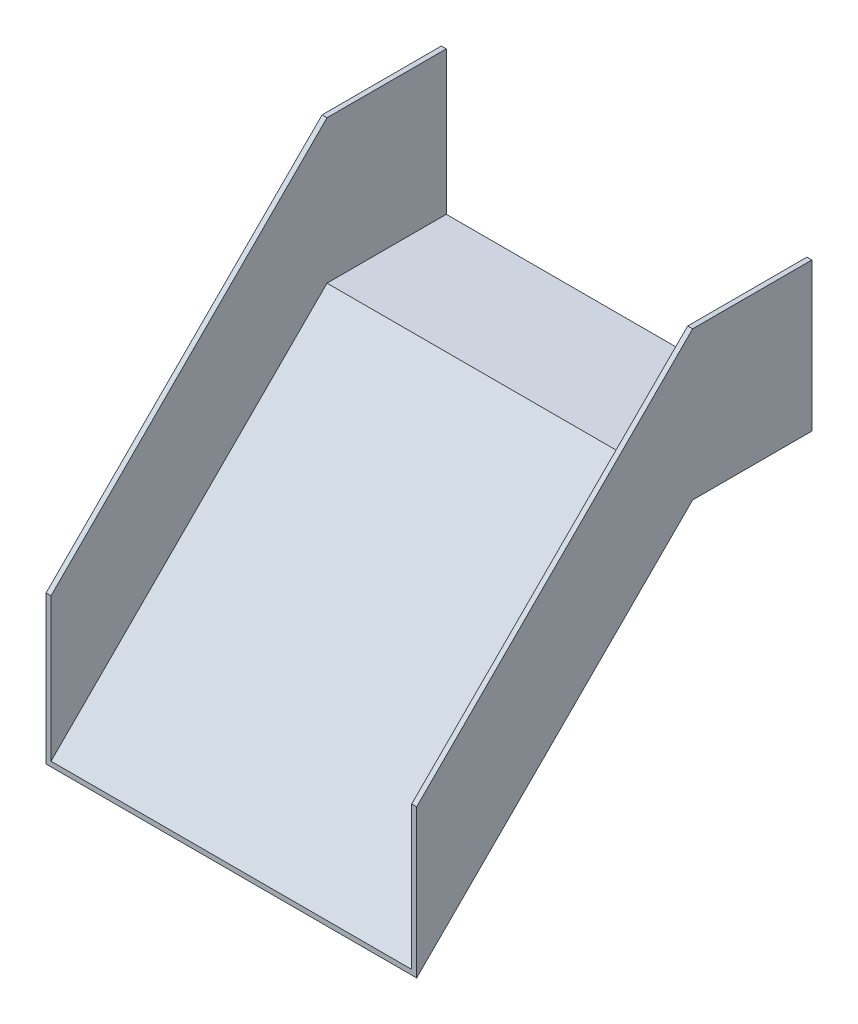
ISO-10303-21;
HEADER;
FILE_DESCRIPTION(('STEP AP214'),'2;1');
FILE_NAME('part.step','',(''),(''),'','','');
FILE_SCHEMA(('AUTOMOTIVE_DESIGN { 1 0 10303 214 1 1 1 1 }'));
ENDSEC;
DATA;
#1=APPLICATION_CONTEXT('core data for automotive mechanical design processes');
#2=APPLICATION_PROTOCOL_DEFINITION('international standard','automotive_design',2000,#1);
#3=PRODUCT_CONTEXT('',#1,'mechanical');
#4=PRODUCT('Part','Part','',(#3));
#5=PRODUCT_RELATED_PRODUCT_CATEGORY('part','',(#4));
#6=PRODUCT_DEFINITION_FORMATION('','',#4);
#7=PRODUCT_DEFINITION_CONTEXT('part definition',#1,'design');
#8=PRODUCT_DEFINITION('design','',#6,#7);
#9=PRODUCT_DEFINITION_SHAPE('','',#8);
#10=(LENGTH_UNIT() NAMED_UNIT(*) SI_UNIT(.MILLI.,.METRE.));
#11=(NAMED_UNIT(*) PLANE_ANGLE_UNIT() SI_UNIT($,.RADIAN.));
#12=(NAMED_UNIT(*) SI_UNIT($,.STERADIAN.) SOLID_ANGLE_UNIT());
#13=UNCERTAINTY_MEASURE_WITH_UNIT(LENGTH_MEASURE(1.E-05),#10,'distance_accuracy_value','');
#14=(GEOMETRIC_REPRESENTATION_CONTEXT(3) GLOBAL_UNCERTAINTY_ASSIGNED_CONTEXT((#13)) GLOBAL_UNIT_ASSIGNED_CONTEXT((#10,
#11,#12)) REPRESENTATION_CONTEXT('',''));
#15=CARTESIAN_POINT('',(0.,0.,0.));
#16=DIRECTION('',(0.,0.,1.));
#17=DIRECTION('',(1.,0.,0.));
#18=AXIS2_PLACEMENT_3D('',#15,#16,#17);
#19=CARTESIAN_POINT('',(150.,60.,48.28));
#20=DIRECTION('',(0.,0.707106781186547,0.707106781186548));
#21=DIRECTION('',(-1.,0.,0.));
#22=AXIS2_PLACEMENT_3D('',#19,#20,#21);
#23=PLANE('',#22);
#24=DIRECTION('',(-1.,0.,0.));
#25=VECTOR('',#24,1.);
#26=CARTESIAN_POINT('',(75.,-51.72,160.));
#27=LINE('',#26,#25);
#28=CARTESIAN_POINT('',(150.,-51.72,160.));
#29=VERTEX_POINT('',#28);
#30=CARTESIAN_POINT('',(148.,-51.72,160.));
#31=VERTEX_POINT('',#30);
#32=EDGE_CURVE('E144',#29,#31,#27,.T.);
#33=ORIENTED_EDGE('',*,*,#32,.F.);
#34=DIRECTION('',(0.,-0.707106781186548,0.707106781186547));
#35=VECTOR('',#34,1.);
#36=CARTESIAN_POINT('',(150.,60.,48.28));
#37=LINE('',#36,#35);
#38=CARTESIAN_POINT('',(150.,60.,48.28));
#39=VERTEX_POINT('',#38);
#40=EDGE_CURVE('E127',#29,#39,#37,.F.);
#41=ORIENTED_EDGE('',*,*,#40,.T.);
#42=DIRECTION('',(-1.,0.,0.));
#43=VECTOR('',#42,1.);
#44=CARTESIAN_POINT('',(149.,60.,48.28));
#45=LINE('',#44,#43);
#46=CARTESIAN_POINT('',(148.,60.,48.28));
#47=VERTEX_POINT('',#46);
#48=EDGE_CURVE('E163',#39,#47,#45,.T.);
#49=ORIENTED_EDGE('',*,*,#48,.T.);
#50=DIRECTION('',(0.,-0.707106781186548,0.707106781186547));
#51=VECTOR('',#50,1.);
#52=CARTESIAN_POINT('',(148.,60.,48.28));
#53=LINE('',#52,#51);
#54=EDGE_CURVE('E150',#47,#31,#53,.T.);
#55=ORIENTED_EDGE('',*,*,#54,.T.);
#56=EDGE_LOOP('',(#33,#41,#49,#55));
#57=FACE_BOUND('',#56,.T.);
#58=ADVANCED_FACE('F17',(#57),#23,.T.);
#59=CARTESIAN_POINT('',(148.,2.,48.28));
#60=DIRECTION('',(0.,0.707106781186547,0.707106781186547));
#61=DIRECTION('',(-1.,0.,0.));
#62=AXIS2_PLACEMENT_3D('',#59,#60,#61);
#63=PLANE('',#62);
#64=DIRECTION('',(-1.,0.,0.));
#65=VECTOR('',#64,1.);
#66=CARTESIAN_POINT('',(75.,-109.72000002,160.));
#67=LINE('',#66,#65);
#68=CARTESIAN_POINT('',(148.000000003125,-109.72000001,160.));
#69=VERTEX_POINT('',#68);
#70=CARTESIAN_POINT('',(2.,-109.72000001,160.));
#71=VERTEX_POINT('',#70);
#72=EDGE_CURVE('E120',#69,#71,#67,.T.);
#73=ORIENTED_EDGE('',*,*,#72,.F.);
#74=DIRECTION('',(0.,-0.707106781186547,0.707106781186547));
#75=VECTOR('',#74,1.);
#76=CARTESIAN_POINT('',(148.0000000125,2.,48.28));
#77=LINE('',#76,#75);
#78=CARTESIAN_POINT('',(148.00000000625,2.,48.28));
#79=VERTEX_POINT('',#78);
#80=EDGE_CURVE('E149',#69,#79,#77,.F.);
#81=ORIENTED_EDGE('',*,*,#80,.T.);
#82=DIRECTION('',(-1.,0.,0.));
#83=VECTOR('',#82,1.);
#84=CARTESIAN_POINT('',(75.,2.,48.28));
#85=LINE('',#84,#83);
#86=CARTESIAN_POINT('',(2.,2.0000000319,48.2799999681));
#87=VERTEX_POINT('',#86);
#88=EDGE_CURVE('E151',#79,#87,#85,.T.);
#89=ORIENTED_EDGE('',*,*,#88,.T.);
#90=DIRECTION('',(0.,-0.707106781186547,0.707106781186547));
#91=VECTOR('',#90,1.);
#92=CARTESIAN_POINT('',(2.,2.,48.28));
#93=LINE('',#92,#91);
#94=EDGE_CURVE('E167',#87,#71,#93,.T.);
#95=ORIENTED_EDGE('',*,*,#94,.T.);
#96=EDGE_LOOP('',(#73,#81,#89,#95));
#97=FACE_BOUND('',#96,.T.);
#98=ADVANCED_FACE('F253',(#97),#63,.T.);
#99=CARTESIAN_POINT('',(0.,-111.72,160.));
#100=DIRECTION('',(0.,0.,1.));
#101=DIRECTION('',(1.,0.,0.));
#102=AXIS2_PLACEMENT_3D('',#99,#100,#101);
#103=PLANE('',#102);
#104=DIRECTION('',(0.,1.,0.));
#105=VECTOR('',#104,1.);
#106=CARTESIAN_POINT('',(2.,-24.86,160.));
#107=LINE('',#106,#105);
#108=CARTESIAN_POINT('',(1.999999975,-51.72000001595,160.));
#109=VERTEX_POINT('',#108);
#110=EDGE_CURVE('E168',#71,#109,#107,.T.);
#111=ORIENTED_EDGE('',*,*,#110,.T.);
#112=DIRECTION('',(1.,0.,0.));
#113=VECTOR('',#112,1.);
#114=CARTESIAN_POINT('',(1.,-51.72,160.));
#115=LINE('',#114,#113);
#116=CARTESIAN_POINT('',(0.,-51.72,160.));
#117=VERTEX_POINT('',#116);
#118=EDGE_CURVE('E171',#117,#109,#115,.T.);
#119=ORIENTED_EDGE('',*,*,#118,.F.);
#120=DIRECTION('',(0.,-1.,0.));
#121=VECTOR('',#120,1.);
#122=CARTESIAN_POINT('',(0.,-25.86,160.));
#123=LINE('',#122,#121);
#124=CARTESIAN_POINT('',(0.,-111.72,160.));
#125=VERTEX_POINT('',#124);
#126=EDGE_CURVE('E117',#117,#125,#123,.T.);
#127=ORIENTED_EDGE('',*,*,#126,.T.);
#128=DIRECTION('',(-1.,0.,0.));
#129=VECTOR('',#128,1.);
#130=CARTESIAN_POINT('',(75.,-111.72,160.));
#131=LINE('',#130,#129);
#132=CARTESIAN_POINT('',(150.,-111.72,160.));
#133=VERTEX_POINT('',#132);
#134=EDGE_CURVE('E111',#133,#125,#131,.T.);
#135=ORIENTED_EDGE('',*,*,#134,.F.);
#136=DIRECTION('',(0.,1.,0.));
#137=VECTOR('',#136,1.);
#138=CARTESIAN_POINT('',(150.,-25.86,160.));
#139=LINE('',#138,#137);
#140=EDGE_CURVE('E115',#133,#29,#139,.T.);
#141=ORIENTED_EDGE('',*,*,#140,.T.);
#142=ORIENTED_EDGE('',*,*,#32,.T.);
#143=DIRECTION('',(0.,-1.,0.));
#144=VECTOR('',#143,1.);
#145=CARTESIAN_POINT('',(148.,-24.86,160.));
#146=LINE('',#145,#144);
#147=EDGE_CURVE('E145',#31,#69,#146,.T.);
#148=ORIENTED_EDGE('',*,*,#147,.T.);
#149=ORIENTED_EDGE('',*,*,#72,.T.);
#150=EDGE_LOOP('',(#111,#119,#127,#135,#141,#142,#148,#149));
#151=FACE_BOUND('',#150,.T.);
#152=ADVANCED_FACE('F114',(#151),#103,.T.);
#153=CARTESIAN_POINT('',(0.,0.,48.28));
#154=DIRECTION('',(0.,-0.707106781186547,-0.707106781186547));
#155=DIRECTION('',(1.,0.,0.));
#156=AXIS2_PLACEMENT_3D('',#153,#154,#155);
#157=PLANE('',#156);
#158=ORIENTED_EDGE('',*,*,#134,.T.);
#159=DIRECTION('',(0.,-0.707106781186547,0.707106781186547));
#160=VECTOR('',#159,1.);
#161=CARTESIAN_POINT('',(0.,0.,48.28));
#162=LINE('',#161,#160);
#163=CARTESIAN_POINT('',(0.,-1.85999948082438E-08,48.2800000186));
#164=VERTEX_POINT('',#163);
#165=EDGE_CURVE('E174',#125,#164,#162,.F.);
#166=ORIENTED_EDGE('',*,*,#165,.T.);
#167=DIRECTION('',(1.,0.,0.));
#168=VECTOR('',#167,1.);
#169=CARTESIAN_POINT('',(75.,0.,48.28));
#170=LINE('',#169,#168);
#171=CARTESIAN_POINT('',(150.,-1.85999969087235E-08,48.2800000186));
#172=VERTEX_POINT('',#171);
#173=EDGE_CURVE('E105',#164,#172,#170,.T.);
#174=ORIENTED_EDGE('',*,*,#173,.T.);
#175=DIRECTION('',(0.,-0.707106781186547,0.707106781186547));
#176=VECTOR('',#175,1.);
#177=CARTESIAN_POINT('',(150.,0.,48.28));
#178=LINE('',#177,#176);
#179=EDGE_CURVE('E21',#172,#133,#178,.T.);
#180=ORIENTED_EDGE('',*,*,#179,.T.);
#181=EDGE_LOOP('',(#158,#166,#174,#180));
#182=FACE_BOUND('',#181,.T.);
#183=ADVANCED_FACE('F130',(#182),#157,.T.);
#184=CARTESIAN_POINT('',(0.,0.,0.));
#185=DIRECTION('',(0.,1.,0.));
#186=DIRECTION('',(0.,0.,1.));
#187=AXIS2_PLACEMENT_3D('',#184,#185,#186);
#188=PLANE('',#187);
#189=DIRECTION('',(0.,0.,1.));
#190=VECTOR('',#189,1.);
#191=CARTESIAN_POINT('',(150.,-3.71999930859346E-08,80.));
#192=LINE('',#191,#190);
#193=CARTESIAN_POINT('',(150.,-9.29999913884538E-09,0.));
#194=VERTEX_POINT('',#193);
#195=EDGE_CURVE('E132',#194,#172,#192,.T.);
#196=ORIENTED_EDGE('',*,*,#195,.T.);
#197=ORIENTED_EDGE('',*,*,#173,.F.);
#198=DIRECTION('',(0.,0.,-1.));
#199=VECTOR('',#198,1.);
#200=CARTESIAN_POINT('',(0.,-3.71999930859346E-08,80.));
#201=LINE('',#200,#199);
#202=CARTESIAN_POINT('',(0.,-1.85999982776908E-08,0.));
#203=VERTEX_POINT('',#202);
#204=EDGE_CURVE('E176',#164,#203,#201,.T.);
#205=ORIENTED_EDGE('',*,*,#204,.T.);
#206=DIRECTION('',(1.,0.,0.));
#207=VECTOR('',#206,1.);
#208=CARTESIAN_POINT('',(75.,0.,0.));
#209=LINE('',#208,#207);
#210=EDGE_CURVE('E217',#203,#194,#209,.T.);
#211=ORIENTED_EDGE('',*,*,#210,.T.);
#212=EDGE_LOOP('',(#196,#197,#205,#211));
#213=FACE_BOUND('',#212,.T.);
#214=ADVANCED_FACE('F299',(#213),#188,.F.);
#215=CARTESIAN_POINT('',(150.,-111.72,0.));
#216=DIRECTION('',(-1.,0.,0.));
#217=DIRECTION('',(0.,0.,1.));
#218=AXIS2_PLACEMENT_3D('',#215,#216,#217);
#219=PLANE('',#218);
#220=DIRECTION('',(0.,0.,1.));
#221=VECTOR('',#220,1.);
#222=CARTESIAN_POINT('',(150.,60.,24.14));
#223=LINE('',#222,#221);
#224=CARTESIAN_POINT('',(150.,60.,0.));
#225=VERTEX_POINT('',#224);
#226=EDGE_CURVE('E203',#225,#39,#223,.T.);
#227=ORIENTED_EDGE('',*,*,#226,.T.);
#228=ORIENTED_EDGE('',*,*,#40,.F.);
#229=ORIENTED_EDGE('',*,*,#140,.F.);
#230=ORIENTED_EDGE('',*,*,#179,.F.);
#231=ORIENTED_EDGE('',*,*,#195,.F.);
#232=DIRECTION('',(0.,1.,0.));
#233=VECTOR('',#232,1.);
#234=CARTESIAN_POINT('',(150.,30.,0.));
#235=LINE('',#234,#233);
#236=EDGE_CURVE('E220',#194,#225,#235,.T.);
#237=ORIENTED_EDGE('',*,*,#236,.T.);
#238=EDGE_LOOP('',(#227,#228,#229,#230,#231,#237));
#239=FACE_BOUND('',#238,.T.);
#240=ADVANCED_FACE('F125',(#239),#219,.F.);
#241=CARTESIAN_POINT('',(148.,60.,48.28));
#242=DIRECTION('',(0.,-1.,0.));
#243=DIRECTION('',(0.,0.,-1.));
#244=AXIS2_PLACEMENT_3D('',#241,#242,#243);
#245=PLANE('',#244);
#246=DIRECTION('',(0.,0.,1.));
#247=VECTOR('',#246,1.);
#248=CARTESIAN_POINT('',(148.,60.,80.));
#249=LINE('',#248,#247);
#250=CARTESIAN_POINT('',(148.0000000125,60.,0.));
#251=VERTEX_POINT('',#250);
#252=EDGE_CURVE('E159',#251,#47,#249,.T.);
#253=ORIENTED_EDGE('',*,*,#252,.T.);
#254=ORIENTED_EDGE('',*,*,#48,.F.);
#255=ORIENTED_EDGE('',*,*,#226,.F.);
#256=DIRECTION('',(-1.,0.,0.));
#257=VECTOR('',#256,1.);
#258=CARTESIAN_POINT('',(75.,60.,0.));
#259=LINE('',#258,#257);
#260=EDGE_CURVE('E223',#225,#251,#259,.T.);
#261=ORIENTED_EDGE('',*,*,#260,.T.);
#262=EDGE_LOOP('',(#253,#254,#255,#261));
#263=FACE_BOUND('',#262,.T.);
#264=ADVANCED_FACE('F268',(#263),#245,.F.);
#265=CARTESIAN_POINT('',(148.,-109.72,160.));
#266=DIRECTION('',(1.,0.,0.));
#267=DIRECTION('',(0.,0.,-1.));
#268=AXIS2_PLACEMENT_3D('',#265,#266,#267);
#269=PLANE('',#268);
#270=DIRECTION('',(0.,0.,1.));
#271=VECTOR('',#270,1.);
#272=CARTESIAN_POINT('',(148.,2.,24.14));
#273=LINE('',#272,#271);
#274=CARTESIAN_POINT('',(148.0000000125,2.0000000269,0.));
#275=VERTEX_POINT('',#274);
#276=EDGE_CURVE('E155',#275,#79,#273,.T.);
#277=ORIENTED_EDGE('',*,*,#276,.T.);
#278=ORIENTED_EDGE('',*,*,#80,.F.);
#279=ORIENTED_EDGE('',*,*,#147,.F.);
#280=ORIENTED_EDGE('',*,*,#54,.F.);
#281=ORIENTED_EDGE('',*,*,#252,.F.);
#282=DIRECTION('',(0.,-1.,0.));
#283=VECTOR('',#282,1.);
#284=CARTESIAN_POINT('',(148.00000005,30.,0.));
#285=LINE('',#284,#283);
#286=EDGE_CURVE('E227',#251,#275,#285,.T.);
#287=ORIENTED_EDGE('',*,*,#286,.T.);
#288=EDGE_LOOP('',(#277,#278,#279,#280,#281,#287));
#289=FACE_BOUND('',#288,.T.);
#290=ADVANCED_FACE('F260',(#289),#269,.F.);
#291=CARTESIAN_POINT('',(2.,2.,0.));
#292=DIRECTION('',(0.,-1.,0.));
#293=DIRECTION('',(1.,0.,0.));
#294=AXIS2_PLACEMENT_3D('',#291,#292,#293);
#295=PLANE('',#294);
#296=DIRECTION('',(0.,0.,1.));
#297=VECTOR('',#296,1.);
#298=CARTESIAN_POINT('',(2.,2.00000006379999,80.));
#299=LINE('',#298,#297);
#300=CARTESIAN_POINT('',(1.9999999875,2.00000001095,0.));
#301=VERTEX_POINT('',#300);
#302=EDGE_CURVE('E154',#301,#87,#299,.T.);
#303=ORIENTED_EDGE('',*,*,#302,.T.);
#304=ORIENTED_EDGE('',*,*,#88,.F.);
#305=ORIENTED_EDGE('',*,*,#276,.F.);
#306=DIRECTION('',(-1.,0.,0.));
#307=VECTOR('',#306,1.);
#308=CARTESIAN_POINT('',(75.,1.99999998,0.));
#309=LINE('',#308,#307);
#310=EDGE_CURVE('E231',#275,#301,#309,.T.);
#311=ORIENTED_EDGE('',*,*,#310,.T.);
#312=EDGE_LOOP('',(#303,#304,#305,#311));
#313=FACE_BOUND('',#312,.T.);
#314=ADVANCED_FACE('F257',(#313),#295,.F.);
#315=CARTESIAN_POINT('',(2.,60.,0.));
#316=DIRECTION('',(-1.,0.,0.));
#317=DIRECTION('',(0.,-1.,0.));
#318=AXIS2_PLACEMENT_3D('',#315,#316,#317);
#319=PLANE('',#318);
#320=DIRECTION('',(0.,0.,1.));
#321=VECTOR('',#320,1.);
#322=CARTESIAN_POINT('',(2.,60.,24.14));
#323=LINE('',#322,#321);
#324=CARTESIAN_POINT('',(1.9999999875,60.,0.));
#325=VERTEX_POINT('',#324);
#326=CARTESIAN_POINT('',(2.,60.,48.28));
#327=VERTEX_POINT('',#326);
#328=EDGE_CURVE('E186',#325,#327,#323,.T.);
#329=ORIENTED_EDGE('',*,*,#328,.T.);
#330=DIRECTION('',(0.,0.707106781186547,-0.707106781186547));
#331=VECTOR('',#330,1.);
#332=CARTESIAN_POINT('',(2.,4.13999999999999,104.14));
#333=LINE('',#332,#331);
#334=EDGE_CURVE('E189',#109,#327,#333,.T.);
#335=ORIENTED_EDGE('',*,*,#334,.F.);
#336=ORIENTED_EDGE('',*,*,#110,.F.);
#337=ORIENTED_EDGE('',*,*,#94,.F.);
#338=ORIENTED_EDGE('',*,*,#302,.F.);
#339=DIRECTION('',(0.,1.,0.));
#340=VECTOR('',#339,1.);
#341=CARTESIAN_POINT('',(1.99999995,30.,0.));
#342=LINE('',#341,#340);
#343=EDGE_CURVE('E235',#301,#325,#342,.T.);
#344=ORIENTED_EDGE('',*,*,#343,.T.);
#345=EDGE_LOOP('',(#329,#335,#336,#337,#338,#344));
#346=FACE_BOUND('',#345,.T.);
#347=ADVANCED_FACE('F243',(#346),#319,.F.);
#348=CARTESIAN_POINT('',(2.,60.,48.28));
#349=DIRECTION('',(0.,0.707106781186547,0.707106781186548));
#350=DIRECTION('',(-1.,0.,0.));
#351=AXIS2_PLACEMENT_3D('',#348,#349,#350);
#352=PLANE('',#351);
#353=ORIENTED_EDGE('',*,*,#118,.T.);
#354=ORIENTED_EDGE('',*,*,#334,.T.);
#355=DIRECTION('',(-1.,0.,0.));
#356=VECTOR('',#355,1.);
#357=CARTESIAN_POINT('',(1.,60.,48.28));
#358=LINE('',#357,#356);
#359=CARTESIAN_POINT('',(0.,60.,48.28));
#360=VERTEX_POINT('',#359);
#361=EDGE_CURVE('E182',#327,#360,#358,.T.);
#362=ORIENTED_EDGE('',*,*,#361,.T.);
#363=DIRECTION('',(0.,-0.707106781186548,0.707106781186547));
#364=VECTOR('',#363,1.);
#365=CARTESIAN_POINT('',(0.,60.,48.28));
#366=LINE('',#365,#364);
#367=EDGE_CURVE('E175',#360,#117,#366,.T.);
#368=ORIENTED_EDGE('',*,*,#367,.T.);
#369=EDGE_LOOP('',(#353,#354,#362,#368));
#370=FACE_BOUND('',#369,.T.);
#371=ADVANCED_FACE('F250',(#370),#352,.T.);
#372=CARTESIAN_POINT('',(0.,-111.72,0.));
#373=DIRECTION('',(1.,0.,0.));
#374=DIRECTION('',(0.,1.,0.));
#375=AXIS2_PLACEMENT_3D('',#372,#373,#374);
#376=PLANE('',#375);
#377=ORIENTED_EDGE('',*,*,#204,.F.);
#378=ORIENTED_EDGE('',*,*,#165,.F.);
#379=ORIENTED_EDGE('',*,*,#126,.F.);
#380=ORIENTED_EDGE('',*,*,#367,.F.);
#381=DIRECTION('',(0.,0.,-1.));
#382=VECTOR('',#381,1.);
#383=CARTESIAN_POINT('',(0.,60.,24.14));
#384=LINE('',#383,#382);
#385=CARTESIAN_POINT('',(0.,60.,0.));
#386=VERTEX_POINT('',#385);
#387=EDGE_CURVE('E28',#360,#386,#384,.T.);
#388=ORIENTED_EDGE('',*,*,#387,.T.);
#389=DIRECTION('',(0.,-1.,0.));
#390=VECTOR('',#389,1.);
#391=CARTESIAN_POINT('',(0.,30.,0.));
#392=LINE('',#391,#390);
#393=EDGE_CURVE('E36',#386,#203,#392,.T.);
#394=ORIENTED_EDGE('',*,*,#393,.T.);
#395=EDGE_LOOP('',(#377,#378,#379,#380,#388,#394));
#396=FACE_BOUND('',#395,.T.);
#397=ADVANCED_FACE('F280',(#396),#376,.F.);
#398=CARTESIAN_POINT('',(0.,0.,0.));
#399=DIRECTION('',(0.,0.,1.));
#400=DIRECTION('',(1.,0.,0.));
#401=AXIS2_PLACEMENT_3D('',#398,#399,#400);
#402=PLANE('',#401);
#403=ORIENTED_EDGE('',*,*,#343,.F.);
#404=ORIENTED_EDGE('',*,*,#310,.F.);
#405=ORIENTED_EDGE('',*,*,#286,.F.);
#406=ORIENTED_EDGE('',*,*,#260,.F.);
#407=ORIENTED_EDGE('',*,*,#236,.F.);
#408=ORIENTED_EDGE('',*,*,#210,.F.);
#409=ORIENTED_EDGE('',*,*,#393,.F.);
#410=DIRECTION('',(1.,0.,0.));
#411=VECTOR('',#410,1.);
#412=CARTESIAN_POINT('',(1.,60.,0.));
#413=LINE('',#412,#411);
#414=EDGE_CURVE('E11',#386,#325,#413,.T.);
#415=ORIENTED_EDGE('',*,*,#414,.T.);
#416=EDGE_LOOP('',(#403,#404,#405,#406,#407,#408,#409,#415));
#417=FACE_BOUND('',#416,.T.);
#418=ADVANCED_FACE('F265',(#417),#402,.F.);
#419=CARTESIAN_POINT('',(0.,60.,48.28));
#420=DIRECTION('',(0.,-1.,0.));
#421=DIRECTION('',(0.,0.,-1.));
#422=AXIS2_PLACEMENT_3D('',#419,#420,#421);
#423=PLANE('',#422);
#424=ORIENTED_EDGE('',*,*,#387,.F.);
#425=ORIENTED_EDGE('',*,*,#361,.F.);
#426=ORIENTED_EDGE('',*,*,#328,.F.);
#427=ORIENTED_EDGE('',*,*,#414,.F.);
#428=EDGE_LOOP('',(#424,#425,#426,#427));
#429=FACE_BOUND('',#428,.T.);
#430=ADVANCED_FACE('F19',(#429),#423,.F.);
#431=CLOSED_SHELL('',(#58,#98,#152,#183,#214,#240,#264,#290,#314,#347,#371,#397,#418,#430));
#432=MANIFOLD_SOLID_BREP('B1',#431);
#433=ADVANCED_BREP_SHAPE_REPRESENTATION('',(#18,#432),#14);
#434=SHAPE_DEFINITION_REPRESENTATION(#9,#433);
ENDSEC;
END-ISO-10303-21;
